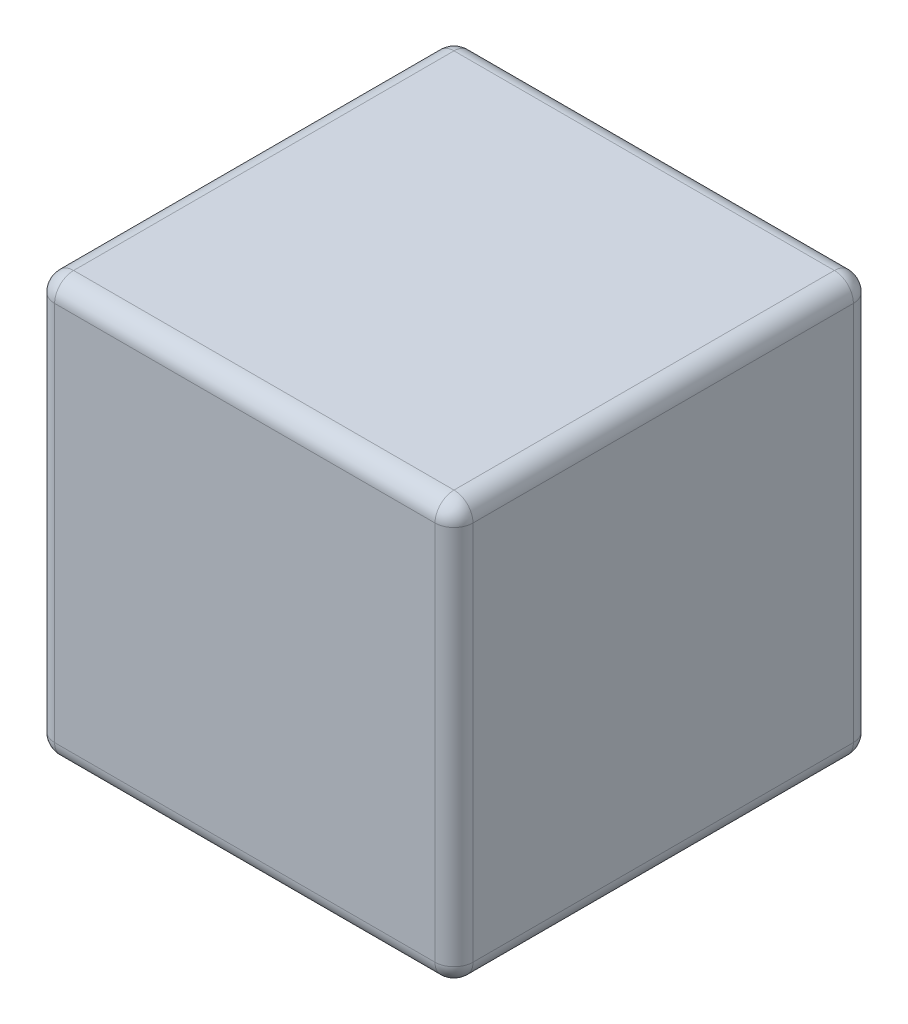
ISO-10303-21;
HEADER;
FILE_DESCRIPTION(('STEP AP214'),'2;1');
FILE_NAME('part.step','',(''),(''),'','','');
FILE_SCHEMA(('AUTOMOTIVE_DESIGN { 1 0 10303 214 1 1 1 1 }'));
ENDSEC;
DATA;
#1=APPLICATION_CONTEXT('core data for automotive mechanical design processes');
#2=APPLICATION_PROTOCOL_DEFINITION('international standard','automotive_design',2000,#1);
#3=PRODUCT_CONTEXT('',#1,'mechanical');
#4=PRODUCT('Part','Part','',(#3));
#5=PRODUCT_RELATED_PRODUCT_CATEGORY('part','',(#4));
#6=PRODUCT_DEFINITION_FORMATION('','',#4);
#7=PRODUCT_DEFINITION_CONTEXT('part definition',#1,'design');
#8=PRODUCT_DEFINITION('design','',#6,#7);
#9=PRODUCT_DEFINITION_SHAPE('','',#8);
#10=(LENGTH_UNIT() NAMED_UNIT(*) SI_UNIT(.MILLI.,.METRE.));
#11=(NAMED_UNIT(*) PLANE_ANGLE_UNIT() SI_UNIT($,.RADIAN.));
#12=(NAMED_UNIT(*) SI_UNIT($,.STERADIAN.) SOLID_ANGLE_UNIT());
#13=UNCERTAINTY_MEASURE_WITH_UNIT(LENGTH_MEASURE(1.E-05),#10,'distance_accuracy_value','');
#14=(GEOMETRIC_REPRESENTATION_CONTEXT(3) GLOBAL_UNCERTAINTY_ASSIGNED_CONTEXT((#13)) GLOBAL_UNIT_ASSIGNED_CONTEXT((#10,
#11,#12)) REPRESENTATION_CONTEXT('',''));
#15=CARTESIAN_POINT('',(0.,0.,0.));
#16=DIRECTION('',(0.,0.,1.));
#17=DIRECTION('',(1.,0.,0.));
#18=AXIS2_PLACEMENT_3D('',#15,#16,#17);
#19=CARTESIAN_POINT('',(27.5,-27.5,-27.5));
#20=DIRECTION('',(1.,0.,0.));
#21=DIRECTION('',(0.,0.,-1.));
#22=AXIS2_PLACEMENT_3D('',#19,#20,#21);
#23=PLANE('',#22);
#24=DIRECTION('',(0.,0.,-1.));
#25=VECTOR('',#24,1.);
#26=CARTESIAN_POINT('',(27.5,-25.,-27.5));
#27=LINE('',#26,#25);
#28=CARTESIAN_POINT('',(27.5,-25.,25.));
#29=VERTEX_POINT('',#28);
#30=CARTESIAN_POINT('',(27.5,-25.,-25.));
#31=VERTEX_POINT('',#30);
#32=EDGE_CURVE('E191',#29,#31,#27,.T.);
#33=ORIENTED_EDGE('',*,*,#32,.T.);
#34=DIRECTION('',(0.,1.,0.));
#35=VECTOR('',#34,1.);
#36=CARTESIAN_POINT('',(27.5,-27.5,-25.));
#37=LINE('',#36,#35);
#38=CARTESIAN_POINT('',(27.5,25.,-25.));
#39=VERTEX_POINT('',#38);
#40=EDGE_CURVE('E194',#31,#39,#37,.T.);
#41=ORIENTED_EDGE('',*,*,#40,.T.);
#42=DIRECTION('',(0.,0.,-1.));
#43=VECTOR('',#42,1.);
#44=CARTESIAN_POINT('',(27.5,25.,-27.5));
#45=LINE('',#44,#43);
#46=CARTESIAN_POINT('',(27.5,25.,25.));
#47=VERTEX_POINT('',#46);
#48=EDGE_CURVE('E189',#39,#47,#45,.F.);
#49=ORIENTED_EDGE('',*,*,#48,.T.);
#50=DIRECTION('',(0.,1.,0.));
#51=VECTOR('',#50,1.);
#52=CARTESIAN_POINT('',(27.5,-27.5,25.));
#53=LINE('',#52,#51);
#54=EDGE_CURVE('E187',#47,#29,#53,.F.);
#55=ORIENTED_EDGE('',*,*,#54,.T.);
#56=EDGE_LOOP('',(#33,#41,#49,#55));
#57=FACE_BOUND('',#56,.T.);
#58=ADVANCED_FACE('F35',(#57),#23,.T.);
#59=CARTESIAN_POINT('',(-27.5,-27.5,27.5));
#60=DIRECTION('',(0.,0.,1.));
#61=DIRECTION('',(1.,0.,0.));
#62=AXIS2_PLACEMENT_3D('',#59,#60,#61);
#63=PLANE('',#62);
#64=DIRECTION('',(0.,1.,0.));
#65=VECTOR('',#64,1.);
#66=CARTESIAN_POINT('',(-25.,-27.5,27.5));
#67=LINE('',#66,#65);
#68=CARTESIAN_POINT('',(-25.,25.,27.5));
#69=VERTEX_POINT('',#68);
#70=CARTESIAN_POINT('',(-25.,-25.,27.5));
#71=VERTEX_POINT('',#70);
#72=EDGE_CURVE('E44',#69,#71,#67,.F.);
#73=ORIENTED_EDGE('',*,*,#72,.T.);
#74=DIRECTION('',(1.,0.,0.));
#75=VECTOR('',#74,1.);
#76=CARTESIAN_POINT('',(27.5,-25.,27.5));
#77=LINE('',#76,#75);
#78=CARTESIAN_POINT('',(25.,-25.,27.5));
#79=VERTEX_POINT('',#78);
#80=EDGE_CURVE('E11',#71,#79,#77,.T.);
#81=ORIENTED_EDGE('',*,*,#80,.T.);
#82=DIRECTION('',(0.,1.,0.));
#83=VECTOR('',#82,1.);
#84=CARTESIAN_POINT('',(25.,-27.5,27.5));
#85=LINE('',#84,#83);
#86=CARTESIAN_POINT('',(25.,25.,27.5));
#87=VERTEX_POINT('',#86);
#88=EDGE_CURVE('E196',#79,#87,#85,.T.);
#89=ORIENTED_EDGE('',*,*,#88,.T.);
#90=DIRECTION('',(1.,0.,0.));
#91=VECTOR('',#90,1.);
#92=CARTESIAN_POINT('',(-27.5,25.,27.5));
#93=LINE('',#92,#91);
#94=EDGE_CURVE('E55',#87,#69,#93,.F.);
#95=ORIENTED_EDGE('',*,*,#94,.T.);
#96=EDGE_LOOP('',(#73,#81,#89,#95));
#97=FACE_BOUND('',#96,.T.);
#98=ADVANCED_FACE('F327',(#97),#63,.T.);
#99=CARTESIAN_POINT('',(-27.5,-27.5,-27.5));
#100=DIRECTION('',(-1.,0.,0.));
#101=DIRECTION('',(0.,0.,1.));
#102=AXIS2_PLACEMENT_3D('',#99,#100,#101);
#103=PLANE('',#102);
#104=DIRECTION('',(0.,0.,1.));
#105=VECTOR('',#104,1.);
#106=CARTESIAN_POINT('',(-27.5,25.,-27.5));
#107=LINE('',#106,#105);
#108=CARTESIAN_POINT('',(-27.5,25.,25.));
#109=VERTEX_POINT('',#108);
#110=CARTESIAN_POINT('',(-27.5,25.,-25.));
#111=VERTEX_POINT('',#110);
#112=EDGE_CURVE('E152',#109,#111,#107,.F.);
#113=ORIENTED_EDGE('',*,*,#112,.T.);
#114=DIRECTION('',(0.,1.,0.));
#115=VECTOR('',#114,1.);
#116=CARTESIAN_POINT('',(-27.5,-27.5,-25.));
#117=LINE('',#116,#115);
#118=CARTESIAN_POINT('',(-27.5,-25.,-25.));
#119=VERTEX_POINT('',#118);
#120=EDGE_CURVE('E156',#111,#119,#117,.F.);
#121=ORIENTED_EDGE('',*,*,#120,.T.);
#122=DIRECTION('',(0.,0.,1.));
#123=VECTOR('',#122,1.);
#124=CARTESIAN_POINT('',(-27.5,-25.,27.5));
#125=LINE('',#124,#123);
#126=CARTESIAN_POINT('',(-27.5,-25.,25.));
#127=VERTEX_POINT('',#126);
#128=EDGE_CURVE('E129',#119,#127,#125,.T.);
#129=ORIENTED_EDGE('',*,*,#128,.T.);
#130=DIRECTION('',(0.,1.,0.));
#131=VECTOR('',#130,1.);
#132=CARTESIAN_POINT('',(-27.5,-27.5,25.));
#133=LINE('',#132,#131);
#134=EDGE_CURVE('E146',#127,#109,#133,.T.);
#135=ORIENTED_EDGE('',*,*,#134,.T.);
#136=EDGE_LOOP('',(#113,#121,#129,#135));
#137=FACE_BOUND('',#136,.T.);
#138=ADVANCED_FACE('F154',(#137),#103,.T.);
#139=CARTESIAN_POINT('',(-27.5,-27.5,-27.5));
#140=DIRECTION('',(0.,0.,-1.));
#141=DIRECTION('',(-1.,0.,0.));
#142=AXIS2_PLACEMENT_3D('',#139,#140,#141);
#143=PLANE('',#142);
#144=DIRECTION('',(-1.,0.,0.));
#145=VECTOR('',#144,1.);
#146=CARTESIAN_POINT('',(-27.5,-25.,-27.5));
#147=LINE('',#146,#145);
#148=CARTESIAN_POINT('',(25.,-25.,-27.5));
#149=VERTEX_POINT('',#148);
#150=CARTESIAN_POINT('',(-25.,-25.,-27.5));
#151=VERTEX_POINT('',#150);
#152=EDGE_CURVE('E182',#149,#151,#147,.T.);
#153=ORIENTED_EDGE('',*,*,#152,.T.);
#154=DIRECTION('',(0.,1.,0.));
#155=VECTOR('',#154,1.);
#156=CARTESIAN_POINT('',(-25.,-27.5,-27.5));
#157=LINE('',#156,#155);
#158=CARTESIAN_POINT('',(-25.,25.,-27.5));
#159=VERTEX_POINT('',#158);
#160=EDGE_CURVE('E185',#151,#159,#157,.T.);
#161=ORIENTED_EDGE('',*,*,#160,.T.);
#162=DIRECTION('',(-1.,0.,0.));
#163=VECTOR('',#162,1.);
#164=CARTESIAN_POINT('',(-27.5,25.,-27.5));
#165=LINE('',#164,#163);
#166=CARTESIAN_POINT('',(25.,25.,-27.5));
#167=VERTEX_POINT('',#166);
#168=EDGE_CURVE('E180',#159,#167,#165,.F.);
#169=ORIENTED_EDGE('',*,*,#168,.T.);
#170=DIRECTION('',(0.,1.,0.));
#171=VECTOR('',#170,1.);
#172=CARTESIAN_POINT('',(25.,-27.5,-27.5));
#173=LINE('',#172,#171);
#174=EDGE_CURVE('E178',#167,#149,#173,.F.);
#175=ORIENTED_EDGE('',*,*,#174,.T.);
#176=EDGE_LOOP('',(#153,#161,#169,#175));
#177=FACE_BOUND('',#176,.T.);
#178=ADVANCED_FACE('F271',(#177),#143,.T.);
#179=CARTESIAN_POINT('',(0.,-27.5,0.));
#180=DIRECTION('',(0.,1.,0.));
#181=DIRECTION('',(0.,0.,1.));
#182=AXIS2_PLACEMENT_3D('',#179,#180,#181);
#183=PLANE('',#182);
#184=DIRECTION('',(1.,0.,0.));
#185=VECTOR('',#184,1.);
#186=CARTESIAN_POINT('',(-27.5,-27.5,25.));
#187=LINE('',#186,#185);
#188=CARTESIAN_POINT('',(25.,-27.5,25.));
#189=VERTEX_POINT('',#188);
#190=CARTESIAN_POINT('',(-25.,-27.5,25.));
#191=VERTEX_POINT('',#190);
#192=EDGE_CURVE('E159',#189,#191,#187,.F.);
#193=ORIENTED_EDGE('',*,*,#192,.T.);
#194=DIRECTION('',(0.,0.,1.));
#195=VECTOR('',#194,1.);
#196=CARTESIAN_POINT('',(-25.,-27.5,-27.5));
#197=LINE('',#196,#195);
#198=CARTESIAN_POINT('',(-25.,-27.5,-25.));
#199=VERTEX_POINT('',#198);
#200=EDGE_CURVE('E131',#191,#199,#197,.F.);
#201=ORIENTED_EDGE('',*,*,#200,.T.);
#202=DIRECTION('',(-1.,0.,0.));
#203=VECTOR('',#202,1.);
#204=CARTESIAN_POINT('',(27.5,-27.5,-25.));
#205=LINE('',#204,#203);
#206=CARTESIAN_POINT('',(25.,-27.5,-25.));
#207=VERTEX_POINT('',#206);
#208=EDGE_CURVE('E166',#199,#207,#205,.F.);
#209=ORIENTED_EDGE('',*,*,#208,.T.);
#210=DIRECTION('',(0.,0.,-1.));
#211=VECTOR('',#210,1.);
#212=CARTESIAN_POINT('',(25.,-27.5,27.5));
#213=LINE('',#212,#211);
#214=EDGE_CURVE('E164',#207,#189,#213,.F.);
#215=ORIENTED_EDGE('',*,*,#214,.T.);
#216=EDGE_LOOP('',(#193,#201,#209,#215));
#217=FACE_BOUND('',#216,.T.);
#218=ADVANCED_FACE('F359',(#217),#183,.F.);
#219=CARTESIAN_POINT('',(0.,27.5,0.));
#220=DIRECTION('',(0.,1.,0.));
#221=DIRECTION('',(0.,0.,1.));
#222=AXIS2_PLACEMENT_3D('',#219,#220,#221);
#223=PLANE('',#222);
#224=DIRECTION('',(-1.,0.,0.));
#225=VECTOR('',#224,1.);
#226=CARTESIAN_POINT('',(0.,27.5,-25.));
#227=LINE('',#226,#225);
#228=CARTESIAN_POINT('',(25.,27.5,-25.));
#229=VERTEX_POINT('',#228);
#230=CARTESIAN_POINT('',(-25.,27.5,-25.));
#231=VERTEX_POINT('',#230);
#232=EDGE_CURVE('E173',#229,#231,#227,.T.);
#233=ORIENTED_EDGE('',*,*,#232,.T.);
#234=DIRECTION('',(0.,0.,1.));
#235=VECTOR('',#234,1.);
#236=CARTESIAN_POINT('',(-25.,27.5,0.));
#237=LINE('',#236,#235);
#238=CARTESIAN_POINT('',(-25.,27.5,25.));
#239=VERTEX_POINT('',#238);
#240=EDGE_CURVE('E175',#231,#239,#237,.T.);
#241=ORIENTED_EDGE('',*,*,#240,.T.);
#242=DIRECTION('',(1.,0.,0.));
#243=VECTOR('',#242,1.);
#244=CARTESIAN_POINT('',(0.,27.5,25.));
#245=LINE('',#244,#243);
#246=CARTESIAN_POINT('',(25.,27.5,25.));
#247=VERTEX_POINT('',#246);
#248=EDGE_CURVE('E169',#239,#247,#245,.T.);
#249=ORIENTED_EDGE('',*,*,#248,.T.);
#250=DIRECTION('',(0.,0.,-1.));
#251=VECTOR('',#250,1.);
#252=CARTESIAN_POINT('',(25.,27.5,0.));
#253=LINE('',#252,#251);
#254=EDGE_CURVE('E171',#247,#229,#253,.T.);
#255=ORIENTED_EDGE('',*,*,#254,.T.);
#256=EDGE_LOOP('',(#233,#241,#249,#255));
#257=FACE_BOUND('',#256,.T.);
#258=ADVANCED_FACE('F280',(#257),#223,.T.);
#259=CARTESIAN_POINT('',(25.,25.,0.));
#260=DIRECTION('',(0.,0.,-1.));
#261=DIRECTION('',(-1.,0.,0.));
#262=AXIS2_PLACEMENT_3D('',#259,#260,#261);
#263=CYLINDRICAL_SURFACE('',#262,2.5);
#264=CARTESIAN_POINT('',(25.,25.,-25.));
#265=DIRECTION('',(0.,0.,-1.));
#266=DIRECTION('',(-1.,0.,0.));
#267=AXIS2_PLACEMENT_3D('',#264,#265,#266);
#268=CIRCLE('',#267,2.5);
#269=EDGE_CURVE('E39',#229,#39,#268,.T.);
#270=ORIENTED_EDGE('',*,*,#269,.F.);
#271=ORIENTED_EDGE('',*,*,#254,.F.);
#272=CARTESIAN_POINT('',(25.,25.,25.));
#273=DIRECTION('',(0.,0.,1.));
#274=DIRECTION('',(1.,0.,0.));
#275=AXIS2_PLACEMENT_3D('',#272,#273,#274);
#276=CIRCLE('',#275,2.5);
#277=EDGE_CURVE('E248',#47,#247,#276,.T.);
#278=ORIENTED_EDGE('',*,*,#277,.F.);
#279=ORIENTED_EDGE('',*,*,#48,.F.);
#280=EDGE_LOOP('',(#270,#271,#278,#279));
#281=FACE_BOUND('',#280,.T.);
#282=ADVANCED_FACE('F37',(#281),#263,.T.);
#283=CARTESIAN_POINT('',(25.,25.,-25.));
#284=DIRECTION('',(0.,0.,1.));
#285=DIRECTION('',(1.,0.,0.));
#286=AXIS2_PLACEMENT_3D('',#283,#284,#285);
#287=SPHERICAL_SURFACE('',#286,2.5);
#288=CARTESIAN_POINT('',(25.,25.,-25.));
#289=DIRECTION('',(1.,0.,0.));
#290=DIRECTION('',(0.,0.,-1.));
#291=AXIS2_PLACEMENT_3D('',#288,#289,#290);
#292=CIRCLE('',#291,2.5);
#293=EDGE_CURVE('E243',#229,#167,#292,.F.);
#294=ORIENTED_EDGE('',*,*,#293,.F.);
#295=ORIENTED_EDGE('',*,*,#269,.T.);
#296=CARTESIAN_POINT('',(25.,25.,-25.));
#297=DIRECTION('',(0.,1.,0.));
#298=DIRECTION('',(0.,0.,1.));
#299=AXIS2_PLACEMENT_3D('',#296,#297,#298);
#300=CIRCLE('',#299,2.5);
#301=EDGE_CURVE('E246',#167,#39,#300,.F.);
#302=ORIENTED_EDGE('',*,*,#301,.F.);
#303=EDGE_LOOP('',(#294,#295,#302));
#304=FACE_BOUND('',#303,.T.);
#305=ADVANCED_FACE('F259',(#304),#287,.T.);
#306=CARTESIAN_POINT('',(25.,25.,25.));
#307=DIRECTION('',(0.,0.,1.));
#308=DIRECTION('',(1.,0.,0.));
#309=AXIS2_PLACEMENT_3D('',#306,#307,#308);
#310=SPHERICAL_SURFACE('',#309,2.5);
#311=CARTESIAN_POINT('',(25.,25.,25.));
#312=DIRECTION('',(0.,1.,0.));
#313=DIRECTION('',(0.,0.,1.));
#314=AXIS2_PLACEMENT_3D('',#311,#312,#313);
#315=CIRCLE('',#314,2.5);
#316=EDGE_CURVE('E237',#47,#87,#315,.F.);
#317=ORIENTED_EDGE('',*,*,#316,.F.);
#318=ORIENTED_EDGE('',*,*,#277,.T.);
#319=CARTESIAN_POINT('',(25.,25.,25.));
#320=DIRECTION('',(1.,0.,0.));
#321=DIRECTION('',(0.,0.,-1.));
#322=AXIS2_PLACEMENT_3D('',#319,#320,#321);
#323=CIRCLE('',#322,2.5);
#324=EDGE_CURVE('E240',#87,#247,#323,.F.);
#325=ORIENTED_EDGE('',*,*,#324,.F.);
#326=EDGE_LOOP('',(#317,#318,#325));
#327=FACE_BOUND('',#326,.T.);
#328=ADVANCED_FACE('F291',(#327),#310,.T.);
#329=CARTESIAN_POINT('',(25.,-27.5,-25.));
#330=DIRECTION('',(0.,1.,0.));
#331=DIRECTION('',(0.,0.,1.));
#332=AXIS2_PLACEMENT_3D('',#329,#330,#331);
#333=CYLINDRICAL_SURFACE('',#332,2.5);
#334=ORIENTED_EDGE('',*,*,#301,.T.);
#335=ORIENTED_EDGE('',*,*,#40,.F.);
#336=CARTESIAN_POINT('',(25.,-25.,-25.));
#337=DIRECTION('',(0.,-1.,0.));
#338=DIRECTION('',(0.,0.,-1.));
#339=AXIS2_PLACEMENT_3D('',#336,#337,#338);
#340=CIRCLE('',#339,2.5);
#341=EDGE_CURVE('E232',#149,#31,#340,.T.);
#342=ORIENTED_EDGE('',*,*,#341,.F.);
#343=ORIENTED_EDGE('',*,*,#174,.F.);
#344=EDGE_LOOP('',(#334,#335,#342,#343));
#345=FACE_BOUND('',#344,.T.);
#346=ADVANCED_FACE('F267',(#345),#333,.T.);
#347=CARTESIAN_POINT('',(0.,25.,-25.));
#348=DIRECTION('',(-1.,0.,0.));
#349=DIRECTION('',(0.,0.,1.));
#350=AXIS2_PLACEMENT_3D('',#347,#348,#349);
#351=CYLINDRICAL_SURFACE('',#350,2.5);
#352=ORIENTED_EDGE('',*,*,#293,.T.);
#353=ORIENTED_EDGE('',*,*,#168,.F.);
#354=CARTESIAN_POINT('',(-25.,25.,-25.));
#355=DIRECTION('',(-1.,0.,0.));
#356=DIRECTION('',(0.,0.,1.));
#357=AXIS2_PLACEMENT_3D('',#354,#355,#356);
#358=CIRCLE('',#357,2.5);
#359=EDGE_CURVE('E229',#231,#159,#358,.T.);
#360=ORIENTED_EDGE('',*,*,#359,.F.);
#361=ORIENTED_EDGE('',*,*,#232,.F.);
#362=EDGE_LOOP('',(#352,#353,#360,#361));
#363=FACE_BOUND('',#362,.T.);
#364=ADVANCED_FACE('F277',(#363),#351,.T.);
#365=CARTESIAN_POINT('',(-25.,25.,0.));
#366=DIRECTION('',(0.,0.,1.));
#367=DIRECTION('',(1.,0.,0.));
#368=AXIS2_PLACEMENT_3D('',#365,#366,#367);
#369=CYLINDRICAL_SURFACE('',#368,2.5);
#370=CARTESIAN_POINT('',(-25.,25.,25.));
#371=DIRECTION('',(0.,0.,1.));
#372=DIRECTION('',(1.,0.,0.));
#373=AXIS2_PLACEMENT_3D('',#370,#371,#372);
#374=CIRCLE('',#373,2.5);
#375=EDGE_CURVE('E223',#239,#109,#374,.T.);
#376=ORIENTED_EDGE('',*,*,#375,.F.);
#377=ORIENTED_EDGE('',*,*,#240,.F.);
#378=CARTESIAN_POINT('',(-25.,25.,-25.));
#379=DIRECTION('',(0.,0.,-1.));
#380=DIRECTION('',(-1.,0.,0.));
#381=AXIS2_PLACEMENT_3D('',#378,#379,#380);
#382=CIRCLE('',#381,2.5);
#383=EDGE_CURVE('E226',#111,#231,#382,.T.);
#384=ORIENTED_EDGE('',*,*,#383,.F.);
#385=ORIENTED_EDGE('',*,*,#112,.F.);
#386=EDGE_LOOP('',(#376,#377,#384,#385));
#387=FACE_BOUND('',#386,.T.);
#388=ADVANCED_FACE('F284',(#387),#369,.T.);
#389=CARTESIAN_POINT('',(0.,25.,25.));
#390=DIRECTION('',(1.,0.,0.));
#391=DIRECTION('',(0.,0.,-1.));
#392=AXIS2_PLACEMENT_3D('',#389,#390,#391);
#393=CYLINDRICAL_SURFACE('',#392,2.5);
#394=ORIENTED_EDGE('',*,*,#324,.T.);
#395=ORIENTED_EDGE('',*,*,#248,.F.);
#396=CARTESIAN_POINT('',(-25.,25.,25.));
#397=DIRECTION('',(-1.,0.,0.));
#398=DIRECTION('',(0.,0.,1.));
#399=AXIS2_PLACEMENT_3D('',#396,#397,#398);
#400=CIRCLE('',#399,2.5);
#401=EDGE_CURVE('E221',#69,#239,#400,.T.);
#402=ORIENTED_EDGE('',*,*,#401,.F.);
#403=ORIENTED_EDGE('',*,*,#94,.F.);
#404=EDGE_LOOP('',(#394,#395,#402,#403));
#405=FACE_BOUND('',#404,.T.);
#406=ADVANCED_FACE('F289',(#405),#393,.T.);
#407=CARTESIAN_POINT('',(25.,-27.5,25.));
#408=DIRECTION('',(0.,1.,0.));
#409=DIRECTION('',(0.,0.,1.));
#410=AXIS2_PLACEMENT_3D('',#407,#408,#409);
#411=CYLINDRICAL_SURFACE('',#410,2.5);
#412=ORIENTED_EDGE('',*,*,#316,.T.);
#413=ORIENTED_EDGE('',*,*,#88,.F.);
#414=CARTESIAN_POINT('',(25.,-25.,25.));
#415=DIRECTION('',(0.,-1.,0.));
#416=DIRECTION('',(0.,0.,-1.));
#417=AXIS2_PLACEMENT_3D('',#414,#415,#416);
#418=CIRCLE('',#417,2.5);
#419=EDGE_CURVE('E218',#29,#79,#418,.T.);
#420=ORIENTED_EDGE('',*,*,#419,.F.);
#421=ORIENTED_EDGE('',*,*,#54,.F.);
#422=EDGE_LOOP('',(#412,#413,#420,#421));
#423=FACE_BOUND('',#422,.T.);
#424=ADVANCED_FACE('F295',(#423),#411,.T.);
#425=CARTESIAN_POINT('',(25.,-25.,-27.5));
#426=DIRECTION('',(0.,0.,1.));
#427=DIRECTION('',(1.,0.,0.));
#428=AXIS2_PLACEMENT_3D('',#425,#426,#427);
#429=CYLINDRICAL_SURFACE('',#428,2.5);
#430=CARTESIAN_POINT('',(25.,-25.,-25.));
#431=DIRECTION('',(0.,0.,-1.));
#432=DIRECTION('',(-1.,0.,0.));
#433=AXIS2_PLACEMENT_3D('',#430,#431,#432);
#434=CIRCLE('',#433,2.5);
#435=EDGE_CURVE('E234',#31,#207,#434,.T.);
#436=ORIENTED_EDGE('',*,*,#435,.F.);
#437=ORIENTED_EDGE('',*,*,#32,.F.);
#438=CARTESIAN_POINT('',(25.,-25.,25.));
#439=DIRECTION('',(0.,0.,1.));
#440=DIRECTION('',(1.,0.,0.));
#441=AXIS2_PLACEMENT_3D('',#438,#439,#440);
#442=CIRCLE('',#441,2.5);
#443=EDGE_CURVE('E215',#189,#29,#442,.T.);
#444=ORIENTED_EDGE('',*,*,#443,.F.);
#445=ORIENTED_EDGE('',*,*,#214,.F.);
#446=EDGE_LOOP('',(#436,#437,#444,#445));
#447=FACE_BOUND('',#446,.T.);
#448=ADVANCED_FACE('F301',(#447),#429,.T.);
#449=CARTESIAN_POINT('',(25.,-25.,-25.));
#450=DIRECTION('',(0.,0.,1.));
#451=DIRECTION('',(1.,0.,0.));
#452=AXIS2_PLACEMENT_3D('',#449,#450,#451);
#453=SPHERICAL_SURFACE('',#452,2.5);
#454=ORIENTED_EDGE('',*,*,#341,.T.);
#455=ORIENTED_EDGE('',*,*,#435,.T.);
#456=CARTESIAN_POINT('',(25.,-25.,-25.));
#457=DIRECTION('',(1.,0.,0.));
#458=DIRECTION('',(0.,0.,-1.));
#459=AXIS2_PLACEMENT_3D('',#456,#457,#458);
#460=CIRCLE('',#459,2.5);
#461=EDGE_CURVE('E212',#149,#207,#460,.F.);
#462=ORIENTED_EDGE('',*,*,#461,.F.);
#463=EDGE_LOOP('',(#454,#455,#462));
#464=FACE_BOUND('',#463,.T.);
#465=ADVANCED_FACE('F305',(#464),#453,.T.);
#466=CARTESIAN_POINT('',(-25.,25.,-25.));
#467=DIRECTION('',(0.,0.,1.));
#468=DIRECTION('',(1.,0.,0.));
#469=AXIS2_PLACEMENT_3D('',#466,#467,#468);
#470=SPHERICAL_SURFACE('',#469,2.5);
#471=ORIENTED_EDGE('',*,*,#383,.T.);
#472=ORIENTED_EDGE('',*,*,#359,.T.);
#473=CARTESIAN_POINT('',(-25.,25.,-25.));
#474=DIRECTION('',(0.,1.,0.));
#475=DIRECTION('',(0.,0.,1.));
#476=AXIS2_PLACEMENT_3D('',#473,#474,#475);
#477=CIRCLE('',#476,2.5);
#478=EDGE_CURVE('E209',#111,#159,#477,.F.);
#479=ORIENTED_EDGE('',*,*,#478,.F.);
#480=EDGE_LOOP('',(#471,#472,#479));
#481=FACE_BOUND('',#480,.T.);
#482=ADVANCED_FACE('F315',(#481),#470,.T.);
#483=CARTESIAN_POINT('',(-25.,25.,25.));
#484=DIRECTION('',(0.,0.,1.));
#485=DIRECTION('',(1.,0.,0.));
#486=AXIS2_PLACEMENT_3D('',#483,#484,#485);
#487=SPHERICAL_SURFACE('',#486,2.5);
#488=ORIENTED_EDGE('',*,*,#401,.T.);
#489=ORIENTED_EDGE('',*,*,#375,.T.);
#490=CARTESIAN_POINT('',(-25.,25.,25.));
#491=DIRECTION('',(0.,1.,0.));
#492=DIRECTION('',(0.,0.,1.));
#493=AXIS2_PLACEMENT_3D('',#490,#491,#492);
#494=CIRCLE('',#493,2.5);
#495=EDGE_CURVE('E149',#69,#109,#494,.F.);
#496=ORIENTED_EDGE('',*,*,#495,.F.);
#497=EDGE_LOOP('',(#488,#489,#496));
#498=FACE_BOUND('',#497,.T.);
#499=ADVANCED_FACE('F317',(#498),#487,.T.);
#500=CARTESIAN_POINT('',(25.,-25.,25.));
#501=DIRECTION('',(0.,0.,1.));
#502=DIRECTION('',(1.,0.,0.));
#503=AXIS2_PLACEMENT_3D('',#500,#501,#502);
#504=SPHERICAL_SURFACE('',#503,2.5);
#505=ORIENTED_EDGE('',*,*,#443,.T.);
#506=ORIENTED_EDGE('',*,*,#419,.T.);
#507=CARTESIAN_POINT('',(25.,-25.,25.));
#508=DIRECTION('',(1.,0.,0.));
#509=DIRECTION('',(0.,1.,0.));
#510=AXIS2_PLACEMENT_3D('',#507,#508,#509);
#511=CIRCLE('',#510,2.5);
#512=EDGE_CURVE('E206',#189,#79,#511,.F.);
#513=ORIENTED_EDGE('',*,*,#512,.F.);
#514=EDGE_LOOP('',(#505,#506,#513));
#515=FACE_BOUND('',#514,.T.);
#516=ADVANCED_FACE('F323',(#515),#504,.T.);
#517=CARTESIAN_POINT('',(-27.5,-25.,-25.));
#518=DIRECTION('',(1.,0.,0.));
#519=DIRECTION('',(0.,0.,-1.));
#520=AXIS2_PLACEMENT_3D('',#517,#518,#519);
#521=CYLINDRICAL_SURFACE('',#520,2.5);
#522=ORIENTED_EDGE('',*,*,#461,.T.);
#523=ORIENTED_EDGE('',*,*,#208,.F.);
#524=CARTESIAN_POINT('',(-25.,-25.,-25.));
#525=DIRECTION('',(-1.,0.,0.));
#526=DIRECTION('',(0.,0.,1.));
#527=AXIS2_PLACEMENT_3D('',#524,#525,#526);
#528=CIRCLE('',#527,2.5);
#529=EDGE_CURVE('E203',#151,#199,#528,.T.);
#530=ORIENTED_EDGE('',*,*,#529,.F.);
#531=ORIENTED_EDGE('',*,*,#152,.F.);
#532=EDGE_LOOP('',(#522,#523,#530,#531));
#533=FACE_BOUND('',#532,.T.);
#534=ADVANCED_FACE('F308',(#533),#521,.T.);
#535=CARTESIAN_POINT('',(-25.,-27.5,-25.));
#536=DIRECTION('',(0.,1.,0.));
#537=DIRECTION('',(0.,0.,1.));
#538=AXIS2_PLACEMENT_3D('',#535,#536,#537);
#539=CYLINDRICAL_SURFACE('',#538,2.5);
#540=ORIENTED_EDGE('',*,*,#478,.T.);
#541=ORIENTED_EDGE('',*,*,#160,.F.);
#542=CARTESIAN_POINT('',(-25.,-25.,-25.));
#543=DIRECTION('',(0.,-1.,0.));
#544=DIRECTION('',(0.,0.,-1.));
#545=AXIS2_PLACEMENT_3D('',#542,#543,#544);
#546=CIRCLE('',#545,2.5);
#547=EDGE_CURVE('E143',#119,#151,#546,.T.);
#548=ORIENTED_EDGE('',*,*,#547,.F.);
#549=ORIENTED_EDGE('',*,*,#120,.F.);
#550=EDGE_LOOP('',(#540,#541,#548,#549));
#551=FACE_BOUND('',#550,.T.);
#552=ADVANCED_FACE('F313',(#551),#539,.T.);
#553=CARTESIAN_POINT('',(-25.,-27.5,25.));
#554=DIRECTION('',(0.,1.,0.));
#555=DIRECTION('',(0.,0.,1.));
#556=AXIS2_PLACEMENT_3D('',#553,#554,#555);
#557=CYLINDRICAL_SURFACE('',#556,2.5);
#558=ORIENTED_EDGE('',*,*,#495,.T.);
#559=ORIENTED_EDGE('',*,*,#134,.F.);
#560=CARTESIAN_POINT('',(-25.,-25.,25.));
#561=DIRECTION('',(0.,-1.,0.));
#562=DIRECTION('',(0.,0.,-1.));
#563=AXIS2_PLACEMENT_3D('',#560,#561,#562);
#564=CIRCLE('',#563,2.5);
#565=EDGE_CURVE('E137',#71,#127,#564,.T.);
#566=ORIENTED_EDGE('',*,*,#565,.F.);
#567=ORIENTED_EDGE('',*,*,#72,.F.);
#568=EDGE_LOOP('',(#558,#559,#566,#567));
#569=FACE_BOUND('',#568,.T.);
#570=ADVANCED_FACE('F147',(#569),#557,.T.);
#571=CARTESIAN_POINT('',(-27.5,-25.,25.));
#572=DIRECTION('',(-1.,0.,0.));
#573=DIRECTION('',(0.,0.,1.));
#574=AXIS2_PLACEMENT_3D('',#571,#572,#573);
#575=CYLINDRICAL_SURFACE('',#574,2.5);
#576=ORIENTED_EDGE('',*,*,#512,.T.);
#577=ORIENTED_EDGE('',*,*,#80,.F.);
#578=CARTESIAN_POINT('',(-25.,-25.,25.));
#579=DIRECTION('',(-1.,0.,0.));
#580=DIRECTION('',(0.,0.,1.));
#581=AXIS2_PLACEMENT_3D('',#578,#579,#580);
#582=CIRCLE('',#581,2.5);
#583=EDGE_CURVE('E141',#191,#71,#582,.T.);
#584=ORIENTED_EDGE('',*,*,#583,.F.);
#585=ORIENTED_EDGE('',*,*,#192,.F.);
#586=EDGE_LOOP('',(#576,#577,#584,#585));
#587=FACE_BOUND('',#586,.T.);
#588=ADVANCED_FACE('F343',(#587),#575,.T.);
#589=CARTESIAN_POINT('',(-25.,-25.,-25.));
#590=DIRECTION('',(0.,0.,1.));
#591=DIRECTION('',(1.,0.,0.));
#592=AXIS2_PLACEMENT_3D('',#589,#590,#591);
#593=SPHERICAL_SURFACE('',#592,2.5);
#594=ORIENTED_EDGE('',*,*,#547,.T.);
#595=ORIENTED_EDGE('',*,*,#529,.T.);
#596=CARTESIAN_POINT('',(-25.,-25.,-25.));
#597=DIRECTION('',(0.,0.,-1.));
#598=DIRECTION('',(-1.,0.,0.));
#599=AXIS2_PLACEMENT_3D('',#596,#597,#598);
#600=CIRCLE('',#599,2.5);
#601=EDGE_CURVE('E134',#119,#199,#600,.F.);
#602=ORIENTED_EDGE('',*,*,#601,.F.);
#603=EDGE_LOOP('',(#594,#595,#602));
#604=FACE_BOUND('',#603,.T.);
#605=ADVANCED_FACE('F340',(#604),#593,.T.);
#606=CARTESIAN_POINT('',(-25.,-25.,25.));
#607=DIRECTION('',(0.,0.,1.));
#608=DIRECTION('',(1.,0.,0.));
#609=AXIS2_PLACEMENT_3D('',#606,#607,#608);
#610=SPHERICAL_SURFACE('',#609,2.5);
#611=ORIENTED_EDGE('',*,*,#583,.T.);
#612=ORIENTED_EDGE('',*,*,#565,.T.);
#613=CARTESIAN_POINT('',(-25.,-25.,25.));
#614=DIRECTION('',(0.,0.,1.));
#615=DIRECTION('',(0.,-1.,0.));
#616=AXIS2_PLACEMENT_3D('',#613,#614,#615);
#617=CIRCLE('',#616,2.5);
#618=EDGE_CURVE('E125',#191,#127,#617,.F.);
#619=ORIENTED_EDGE('',*,*,#618,.F.);
#620=EDGE_LOOP('',(#611,#612,#619));
#621=FACE_BOUND('',#620,.T.);
#622=ADVANCED_FACE('F139',(#621),#610,.T.);
#623=CARTESIAN_POINT('',(-25.,-25.,-27.5));
#624=DIRECTION('',(0.,0.,-1.));
#625=DIRECTION('',(-1.,0.,0.));
#626=AXIS2_PLACEMENT_3D('',#623,#624,#625);
#627=CYLINDRICAL_SURFACE('',#626,2.5);
#628=ORIENTED_EDGE('',*,*,#601,.T.);
#629=ORIENTED_EDGE('',*,*,#200,.F.);
#630=ORIENTED_EDGE('',*,*,#618,.T.);
#631=ORIENTED_EDGE('',*,*,#128,.F.);
#632=EDGE_LOOP('',(#628,#629,#630,#631));
#633=FACE_BOUND('',#632,.T.);
#634=ADVANCED_FACE('F127',(#633),#627,.T.);
#635=CLOSED_SHELL('',(#58,#98,#138,#178,#218,#258,#282,#305,#328,#346,#364,#388,#406,#424,#448,
#465,#482,#499,#516,#534,#552,#570,#588,#605,#622,#634));
#636=MANIFOLD_SOLID_BREP('B2',#635);
#637=ADVANCED_BREP_SHAPE_REPRESENTATION('',(#18,#636),#14);
#638=SHAPE_DEFINITION_REPRESENTATION(#9,#637);
ENDSEC;
END-ISO-10303-21;
